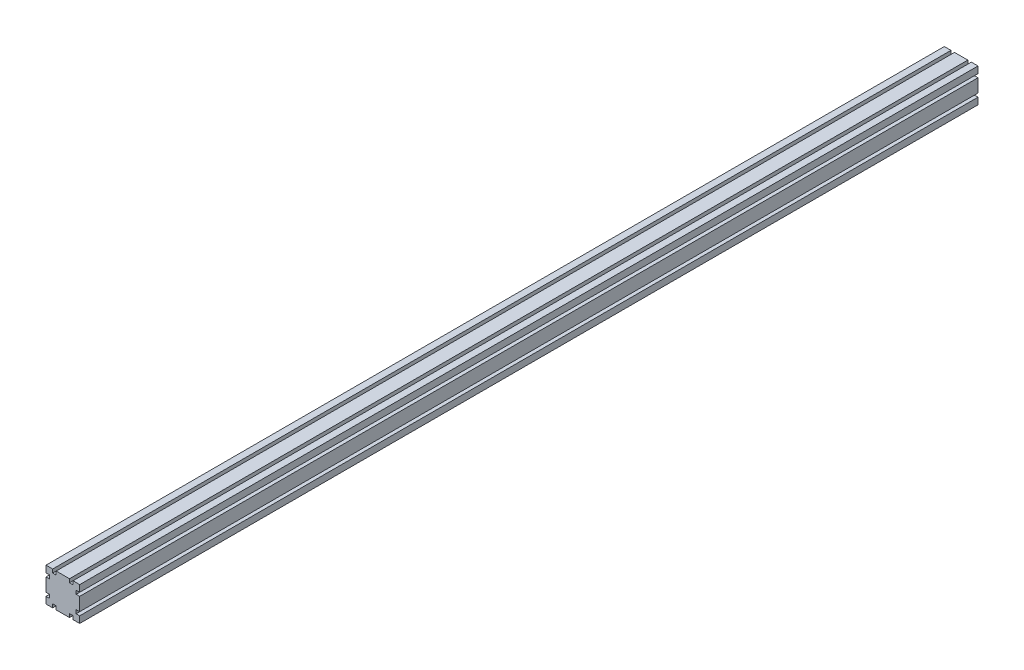
ISO-10303-21;
HEADER;
FILE_DESCRIPTION(('STEP AP214'),'2;1');
FILE_NAME('part.step','',(''),(''),'','','');
FILE_SCHEMA(('AUTOMOTIVE_DESIGN { 1 0 10303 214 1 1 1 1 }'));
ENDSEC;
DATA;
#1=APPLICATION_CONTEXT('core data for automotive mechanical design processes');
#2=APPLICATION_PROTOCOL_DEFINITION('international standard','automotive_design',2000,#1);
#3=PRODUCT_CONTEXT('',#1,'mechanical');
#4=PRODUCT('Part','Part','',(#3));
#5=PRODUCT_RELATED_PRODUCT_CATEGORY('part','',(#4));
#6=PRODUCT_DEFINITION_FORMATION('','',#4);
#7=PRODUCT_DEFINITION_CONTEXT('part definition',#1,'design');
#8=PRODUCT_DEFINITION('design','',#6,#7);
#9=PRODUCT_DEFINITION_SHAPE('','',#8);
#10=(LENGTH_UNIT() NAMED_UNIT(*) SI_UNIT(.MILLI.,.METRE.));
#11=(NAMED_UNIT(*) PLANE_ANGLE_UNIT() SI_UNIT($,.RADIAN.));
#12=(NAMED_UNIT(*) SI_UNIT($,.STERADIAN.) SOLID_ANGLE_UNIT());
#13=UNCERTAINTY_MEASURE_WITH_UNIT(LENGTH_MEASURE(1.E-05),#10,'distance_accuracy_value','');
#14=(GEOMETRIC_REPRESENTATION_CONTEXT(3) GLOBAL_UNCERTAINTY_ASSIGNED_CONTEXT((#13)) GLOBAL_UNIT_ASSIGNED_CONTEXT((#10,
#11,#12)) REPRESENTATION_CONTEXT('',''));
#15=CARTESIAN_POINT('',(0.,0.,0.));
#16=DIRECTION('',(0.,0.,1.));
#17=DIRECTION('',(1.,0.,0.));
#18=AXIS2_PLACEMENT_3D('',#15,#16,#17);
#19=CARTESIAN_POINT('',(-38.1,-23.05,2032.));
#20=DIRECTION('',(1.,0.,0.));
#21=DIRECTION('',(0.,0.,-1.));
#22=AXIS2_PLACEMENT_3D('',#19,#20,#21);
#23=PLANE('',#22);
#24=DIRECTION('',(0.,-1.,0.));
#25=VECTOR('',#24,1.);
#26=CARTESIAN_POINT('',(-38.1,-23.05,0.));
#27=LINE('',#26,#25);
#28=CARTESIAN_POINT('',(-38.1,-23.05,0.));
#29=VERTEX_POINT('',#28);
#30=CARTESIAN_POINT('',(-38.1,-38.1,0.));
#31=VERTEX_POINT('',#30);
#32=EDGE_CURVE('E303',#29,#31,#27,.T.);
#33=ORIENTED_EDGE('',*,*,#32,.T.);
#34=DIRECTION('',(0.,0.,-1.));
#35=VECTOR('',#34,1.);
#36=CARTESIAN_POINT('',(-38.1,-38.1,2032.));
#37=LINE('',#36,#35);
#38=CARTESIAN_POINT('',(-38.1,-38.1,2032.));
#39=VERTEX_POINT('',#38);
#40=EDGE_CURVE('E11',#39,#31,#37,.T.);
#41=ORIENTED_EDGE('',*,*,#40,.F.);
#42=DIRECTION('',(0.,-1.,0.));
#43=VECTOR('',#42,1.);
#44=CARTESIAN_POINT('',(-38.1,-23.05,2032.));
#45=LINE('',#44,#43);
#46=CARTESIAN_POINT('',(-38.1,-23.05,2032.));
#47=VERTEX_POINT('',#46);
#48=EDGE_CURVE('E373',#47,#39,#45,.T.);
#49=ORIENTED_EDGE('',*,*,#48,.F.);
#50=DIRECTION('',(0.,0.,-1.));
#51=VECTOR('',#50,1.);
#52=CARTESIAN_POINT('',(-38.1,-23.05,2032.));
#53=LINE('',#52,#51);
#54=EDGE_CURVE('E299',#47,#29,#53,.T.);
#55=ORIENTED_EDGE('',*,*,#54,.T.);
#56=EDGE_LOOP('',(#33,#41,#49,#55));
#57=FACE_BOUND('',#56,.T.);
#58=ADVANCED_FACE('F39',(#57),#23,.F.);
#59=CARTESIAN_POINT('',(-38.1,-38.1,2032.));
#60=DIRECTION('',(0.,1.,0.));
#61=DIRECTION('',(0.,0.,1.));
#62=AXIS2_PLACEMENT_3D('',#59,#60,#61);
#63=PLANE('',#62);
#64=DIRECTION('',(1.,0.,0.));
#65=VECTOR('',#64,1.);
#66=CARTESIAN_POINT('',(-38.1,-38.1,0.));
#67=LINE('',#66,#65);
#68=CARTESIAN_POINT('',(-23.05,-38.1,0.));
#69=VERTEX_POINT('',#68);
#70=EDGE_CURVE('E306',#31,#69,#67,.T.);
#71=ORIENTED_EDGE('',*,*,#70,.T.);
#72=DIRECTION('',(0.,0.,-1.));
#73=VECTOR('',#72,1.);
#74=CARTESIAN_POINT('',(-23.05,-38.1,2032.));
#75=LINE('',#74,#73);
#76=CARTESIAN_POINT('',(-23.05,-38.1,2032.));
#77=VERTEX_POINT('',#76);
#78=EDGE_CURVE('E47',#77,#69,#75,.T.);
#79=ORIENTED_EDGE('',*,*,#78,.F.);
#80=DIRECTION('',(1.,0.,0.));
#81=VECTOR('',#80,1.);
#82=CARTESIAN_POINT('',(-38.1,-38.1,2032.));
#83=LINE('',#82,#81);
#84=EDGE_CURVE('E182',#39,#77,#83,.T.);
#85=ORIENTED_EDGE('',*,*,#84,.F.);
#86=ORIENTED_EDGE('',*,*,#40,.T.);
#87=EDGE_LOOP('',(#71,#79,#85,#86));
#88=FACE_BOUND('',#87,.T.);
#89=ADVANCED_FACE('F571',(#88),#63,.F.);
#90=CARTESIAN_POINT('',(-23.05,-38.1,2032.));
#91=DIRECTION('',(-1.,0.,0.));
#92=DIRECTION('',(0.,0.,1.));
#93=AXIS2_PLACEMENT_3D('',#90,#91,#92);
#94=PLANE('',#93);
#95=DIRECTION('',(0.,1.,0.));
#96=VECTOR('',#95,1.);
#97=CARTESIAN_POINT('',(-23.05,-38.1,0.));
#98=LINE('',#97,#96);
#99=CARTESIAN_POINT('',(-23.05,-30.1,0.));
#100=VERTEX_POINT('',#99);
#101=EDGE_CURVE('E308',#69,#100,#98,.T.);
#102=ORIENTED_EDGE('',*,*,#101,.T.);
#103=DIRECTION('',(0.,0.,-1.));
#104=VECTOR('',#103,1.);
#105=CARTESIAN_POINT('',(-23.05,-30.1,2032.));
#106=LINE('',#105,#104);
#107=CARTESIAN_POINT('',(-23.05,-30.1,2032.));
#108=VERTEX_POINT('',#107);
#109=EDGE_CURVE('E464',#108,#100,#106,.T.);
#110=ORIENTED_EDGE('',*,*,#109,.F.);
#111=DIRECTION('',(0.,1.,0.));
#112=VECTOR('',#111,1.);
#113=CARTESIAN_POINT('',(-23.05,-38.1,2032.));
#114=LINE('',#113,#112);
#115=EDGE_CURVE('E472',#77,#108,#114,.T.);
#116=ORIENTED_EDGE('',*,*,#115,.F.);
#117=ORIENTED_EDGE('',*,*,#78,.T.);
#118=EDGE_LOOP('',(#102,#110,#116,#117));
#119=FACE_BOUND('',#118,.T.);
#120=ADVANCED_FACE('F470',(#119),#94,.F.);
#121=CARTESIAN_POINT('',(-23.05,-30.1,2032.));
#122=DIRECTION('',(0.,1.,0.));
#123=DIRECTION('',(0.,0.,1.));
#124=AXIS2_PLACEMENT_3D('',#121,#122,#123);
#125=PLANE('',#124);
#126=DIRECTION('',(1.,0.,0.));
#127=VECTOR('',#126,1.);
#128=CARTESIAN_POINT('',(-23.05,-30.1,0.));
#129=LINE('',#128,#127);
#130=CARTESIAN_POINT('',(-15.05,-30.1,0.));
#131=VERTEX_POINT('',#130);
#132=EDGE_CURVE('E310',#100,#131,#129,.T.);
#133=ORIENTED_EDGE('',*,*,#132,.T.);
#134=DIRECTION('',(0.,0.,-1.));
#135=VECTOR('',#134,1.);
#136=CARTESIAN_POINT('',(-15.05,-30.1,2032.));
#137=LINE('',#136,#135);
#138=CARTESIAN_POINT('',(-15.05,-30.1,2032.));
#139=VERTEX_POINT('',#138);
#140=EDGE_CURVE('E461',#139,#131,#137,.T.);
#141=ORIENTED_EDGE('',*,*,#140,.F.);
#142=DIRECTION('',(1.,0.,0.));
#143=VECTOR('',#142,1.);
#144=CARTESIAN_POINT('',(-23.05,-30.1,2032.));
#145=LINE('',#144,#143);
#146=EDGE_CURVE('E490',#108,#139,#145,.T.);
#147=ORIENTED_EDGE('',*,*,#146,.F.);
#148=ORIENTED_EDGE('',*,*,#109,.T.);
#149=EDGE_LOOP('',(#133,#141,#147,#148));
#150=FACE_BOUND('',#149,.T.);
#151=ADVANCED_FACE('F481',(#150),#125,.F.);
#152=CARTESIAN_POINT('',(-15.05,-30.1,2032.));
#153=DIRECTION('',(1.,0.,0.));
#154=DIRECTION('',(0.,0.,-1.));
#155=AXIS2_PLACEMENT_3D('',#152,#153,#154);
#156=PLANE('',#155);
#157=DIRECTION('',(0.,-1.,0.));
#158=VECTOR('',#157,1.);
#159=CARTESIAN_POINT('',(-15.05,-30.1,0.));
#160=LINE('',#159,#158);
#161=CARTESIAN_POINT('',(-15.05,-38.1,0.));
#162=VERTEX_POINT('',#161);
#163=EDGE_CURVE('E312',#131,#162,#160,.T.);
#164=ORIENTED_EDGE('',*,*,#163,.T.);
#165=DIRECTION('',(0.,0.,-1.));
#166=VECTOR('',#165,1.);
#167=CARTESIAN_POINT('',(-15.05,-38.1,2032.));
#168=LINE('',#167,#166);
#169=CARTESIAN_POINT('',(-15.05,-38.1,2032.));
#170=VERTEX_POINT('',#169);
#171=EDGE_CURVE('E458',#170,#162,#168,.T.);
#172=ORIENTED_EDGE('',*,*,#171,.F.);
#173=DIRECTION('',(0.,-1.,0.));
#174=VECTOR('',#173,1.);
#175=CARTESIAN_POINT('',(-15.05,-30.1,2032.));
#176=LINE('',#175,#174);
#177=EDGE_CURVE('E487',#139,#170,#176,.T.);
#178=ORIENTED_EDGE('',*,*,#177,.F.);
#179=ORIENTED_EDGE('',*,*,#140,.T.);
#180=EDGE_LOOP('',(#164,#172,#178,#179));
#181=FACE_BOUND('',#180,.T.);
#182=ADVANCED_FACE('F485',(#181),#156,.F.);
#183=CARTESIAN_POINT('',(-15.05,-38.1,2032.));
#184=DIRECTION('',(0.,1.,0.));
#185=DIRECTION('',(0.,0.,1.));
#186=AXIS2_PLACEMENT_3D('',#183,#184,#185);
#187=PLANE('',#186);
#188=DIRECTION('',(1.,0.,0.));
#189=VECTOR('',#188,1.);
#190=CARTESIAN_POINT('',(-15.05,-38.1,0.));
#191=LINE('',#190,#189);
#192=CARTESIAN_POINT('',(15.05,-38.1,0.));
#193=VERTEX_POINT('',#192);
#194=EDGE_CURVE('E314',#162,#193,#191,.T.);
#195=ORIENTED_EDGE('',*,*,#194,.T.);
#196=DIRECTION('',(0.,0.,-1.));
#197=VECTOR('',#196,1.);
#198=CARTESIAN_POINT('',(15.05,-38.1,2032.));
#199=LINE('',#198,#197);
#200=CARTESIAN_POINT('',(15.05,-38.1,2032.));
#201=VERTEX_POINT('',#200);
#202=EDGE_CURVE('E455',#201,#193,#199,.T.);
#203=ORIENTED_EDGE('',*,*,#202,.F.);
#204=DIRECTION('',(1.,0.,0.));
#205=VECTOR('',#204,1.);
#206=CARTESIAN_POINT('',(-15.05,-38.1,2032.));
#207=LINE('',#206,#205);
#208=EDGE_CURVE('E489',#170,#201,#207,.T.);
#209=ORIENTED_EDGE('',*,*,#208,.F.);
#210=ORIENTED_EDGE('',*,*,#171,.T.);
#211=EDGE_LOOP('',(#195,#203,#209,#210));
#212=FACE_BOUND('',#211,.T.);
#213=ADVANCED_FACE('F584',(#212),#187,.F.);
#214=CARTESIAN_POINT('',(15.05,-38.1,2032.));
#215=DIRECTION('',(-1.,0.,0.));
#216=DIRECTION('',(0.,0.,1.));
#217=AXIS2_PLACEMENT_3D('',#214,#215,#216);
#218=PLANE('',#217);
#219=DIRECTION('',(0.,1.,0.));
#220=VECTOR('',#219,1.);
#221=CARTESIAN_POINT('',(15.05,-38.1,0.));
#222=LINE('',#221,#220);
#223=CARTESIAN_POINT('',(15.05,-30.1,0.));
#224=VERTEX_POINT('',#223);
#225=EDGE_CURVE('E316',#193,#224,#222,.T.);
#226=ORIENTED_EDGE('',*,*,#225,.T.);
#227=DIRECTION('',(0.,0.,-1.));
#228=VECTOR('',#227,1.);
#229=CARTESIAN_POINT('',(15.05,-30.1,2032.));
#230=LINE('',#229,#228);
#231=CARTESIAN_POINT('',(15.05,-30.1,2032.));
#232=VERTEX_POINT('',#231);
#233=EDGE_CURVE('E452',#232,#224,#230,.T.);
#234=ORIENTED_EDGE('',*,*,#233,.F.);
#235=DIRECTION('',(0.,1.,0.));
#236=VECTOR('',#235,1.);
#237=CARTESIAN_POINT('',(15.05,-38.1,2032.));
#238=LINE('',#237,#236);
#239=EDGE_CURVE('E492',#201,#232,#238,.T.);
#240=ORIENTED_EDGE('',*,*,#239,.F.);
#241=ORIENTED_EDGE('',*,*,#202,.T.);
#242=EDGE_LOOP('',(#226,#234,#240,#241));
#243=FACE_BOUND('',#242,.T.);
#244=ADVANCED_FACE('F587',(#243),#218,.F.);
#245=CARTESIAN_POINT('',(15.05,-30.1,2032.));
#246=DIRECTION('',(0.,1.,0.));
#247=DIRECTION('',(0.,0.,1.));
#248=AXIS2_PLACEMENT_3D('',#245,#246,#247);
#249=PLANE('',#248);
#250=DIRECTION('',(1.,0.,0.));
#251=VECTOR('',#250,1.);
#252=CARTESIAN_POINT('',(15.05,-30.1,0.));
#253=LINE('',#252,#251);
#254=CARTESIAN_POINT('',(23.05,-30.1,0.));
#255=VERTEX_POINT('',#254);
#256=EDGE_CURVE('E318',#224,#255,#253,.T.);
#257=ORIENTED_EDGE('',*,*,#256,.T.);
#258=DIRECTION('',(0.,0.,-1.));
#259=VECTOR('',#258,1.);
#260=CARTESIAN_POINT('',(23.05,-30.1,2032.));
#261=LINE('',#260,#259);
#262=CARTESIAN_POINT('',(23.05,-30.1,2032.));
#263=VERTEX_POINT('',#262);
#264=EDGE_CURVE('E449',#263,#255,#261,.T.);
#265=ORIENTED_EDGE('',*,*,#264,.F.);
#266=DIRECTION('',(1.,0.,0.));
#267=VECTOR('',#266,1.);
#268=CARTESIAN_POINT('',(15.05,-30.1,2032.));
#269=LINE('',#268,#267);
#270=EDGE_CURVE('E498',#232,#263,#269,.T.);
#271=ORIENTED_EDGE('',*,*,#270,.F.);
#272=ORIENTED_EDGE('',*,*,#233,.T.);
#273=EDGE_LOOP('',(#257,#265,#271,#272));
#274=FACE_BOUND('',#273,.T.);
#275=ADVANCED_FACE('F591',(#274),#249,.F.);
#276=CARTESIAN_POINT('',(23.05,-30.1,2032.));
#277=DIRECTION('',(1.,0.,0.));
#278=DIRECTION('',(0.,0.,-1.));
#279=AXIS2_PLACEMENT_3D('',#276,#277,#278);
#280=PLANE('',#279);
#281=DIRECTION('',(0.,-1.,0.));
#282=VECTOR('',#281,1.);
#283=CARTESIAN_POINT('',(23.05,-30.1,0.));
#284=LINE('',#283,#282);
#285=CARTESIAN_POINT('',(23.05,-38.1,0.));
#286=VERTEX_POINT('',#285);
#287=EDGE_CURVE('E320',#255,#286,#284,.T.);
#288=ORIENTED_EDGE('',*,*,#287,.T.);
#289=DIRECTION('',(0.,0.,-1.));
#290=VECTOR('',#289,1.);
#291=CARTESIAN_POINT('',(23.05,-38.1,2032.));
#292=LINE('',#291,#290);
#293=CARTESIAN_POINT('',(23.05,-38.1,2032.));
#294=VERTEX_POINT('',#293);
#295=EDGE_CURVE('E446',#294,#286,#292,.T.);
#296=ORIENTED_EDGE('',*,*,#295,.F.);
#297=DIRECTION('',(0.,-1.,0.));
#298=VECTOR('',#297,1.);
#299=CARTESIAN_POINT('',(23.05,-30.1,2032.));
#300=LINE('',#299,#298);
#301=EDGE_CURVE('E500',#263,#294,#300,.T.);
#302=ORIENTED_EDGE('',*,*,#301,.F.);
#303=ORIENTED_EDGE('',*,*,#264,.T.);
#304=EDGE_LOOP('',(#288,#296,#302,#303));
#305=FACE_BOUND('',#304,.T.);
#306=ADVANCED_FACE('F595',(#305),#280,.F.);
#307=CARTESIAN_POINT('',(23.05,-38.1,2032.));
#308=DIRECTION('',(0.,1.,0.));
#309=DIRECTION('',(0.,0.,1.));
#310=AXIS2_PLACEMENT_3D('',#307,#308,#309);
#311=PLANE('',#310);
#312=DIRECTION('',(1.,0.,0.));
#313=VECTOR('',#312,1.);
#314=CARTESIAN_POINT('',(23.05,-38.1,0.));
#315=LINE('',#314,#313);
#316=CARTESIAN_POINT('',(38.1,-38.1,0.));
#317=VERTEX_POINT('',#316);
#318=EDGE_CURVE('E322',#286,#317,#315,.T.);
#319=ORIENTED_EDGE('',*,*,#318,.T.);
#320=DIRECTION('',(0.,0.,-1.));
#321=VECTOR('',#320,1.);
#322=CARTESIAN_POINT('',(38.1,-38.1,2032.));
#323=LINE('',#322,#321);
#324=CARTESIAN_POINT('',(38.1,-38.1,2032.));
#325=VERTEX_POINT('',#324);
#326=EDGE_CURVE('E443',#325,#317,#323,.T.);
#327=ORIENTED_EDGE('',*,*,#326,.F.);
#328=DIRECTION('',(1.,0.,0.));
#329=VECTOR('',#328,1.);
#330=CARTESIAN_POINT('',(23.05,-38.1,2032.));
#331=LINE('',#330,#329);
#332=EDGE_CURVE('E502',#294,#325,#331,.T.);
#333=ORIENTED_EDGE('',*,*,#332,.F.);
#334=ORIENTED_EDGE('',*,*,#295,.T.);
#335=EDGE_LOOP('',(#319,#327,#333,#334));
#336=FACE_BOUND('',#335,.T.);
#337=ADVANCED_FACE('F599',(#336),#311,.F.);
#338=CARTESIAN_POINT('',(38.1,-38.1,2032.));
#339=DIRECTION('',(-1.,0.,0.));
#340=DIRECTION('',(0.,0.,1.));
#341=AXIS2_PLACEMENT_3D('',#338,#339,#340);
#342=PLANE('',#341);
#343=DIRECTION('',(0.,1.,0.));
#344=VECTOR('',#343,1.);
#345=CARTESIAN_POINT('',(38.1,-38.1,0.));
#346=LINE('',#345,#344);
#347=CARTESIAN_POINT('',(38.1,-23.05,0.));
#348=VERTEX_POINT('',#347);
#349=EDGE_CURVE('E324',#317,#348,#346,.T.);
#350=ORIENTED_EDGE('',*,*,#349,.T.);
#351=DIRECTION('',(0.,0.,-1.));
#352=VECTOR('',#351,1.);
#353=CARTESIAN_POINT('',(38.1,-23.05,2032.));
#354=LINE('',#353,#352);
#355=CARTESIAN_POINT('',(38.1,-23.05,2032.));
#356=VERTEX_POINT('',#355);
#357=EDGE_CURVE('E440',#356,#348,#354,.T.);
#358=ORIENTED_EDGE('',*,*,#357,.F.);
#359=DIRECTION('',(0.,1.,0.));
#360=VECTOR('',#359,1.);
#361=CARTESIAN_POINT('',(38.1,-38.1,2032.));
#362=LINE('',#361,#360);
#363=EDGE_CURVE('E504',#325,#356,#362,.T.);
#364=ORIENTED_EDGE('',*,*,#363,.F.);
#365=ORIENTED_EDGE('',*,*,#326,.T.);
#366=EDGE_LOOP('',(#350,#358,#364,#365));
#367=FACE_BOUND('',#366,.T.);
#368=ADVANCED_FACE('F603',(#367),#342,.F.);
#369=CARTESIAN_POINT('',(38.1,-23.05,2032.));
#370=DIRECTION('',(0.,-1.,0.));
#371=DIRECTION('',(0.,0.,-1.));
#372=AXIS2_PLACEMENT_3D('',#369,#370,#371);
#373=PLANE('',#372);
#374=DIRECTION('',(-1.,0.,0.));
#375=VECTOR('',#374,1.);
#376=CARTESIAN_POINT('',(38.1,-23.05,0.));
#377=LINE('',#376,#375);
#378=CARTESIAN_POINT('',(30.1,-23.05,0.));
#379=VERTEX_POINT('',#378);
#380=EDGE_CURVE('E326',#348,#379,#377,.T.);
#381=ORIENTED_EDGE('',*,*,#380,.T.);
#382=DIRECTION('',(0.,0.,-1.));
#383=VECTOR('',#382,1.);
#384=CARTESIAN_POINT('',(30.1,-23.05,2032.));
#385=LINE('',#384,#383);
#386=CARTESIAN_POINT('',(30.1,-23.05,2032.));
#387=VERTEX_POINT('',#386);
#388=EDGE_CURVE('E437',#387,#379,#385,.T.);
#389=ORIENTED_EDGE('',*,*,#388,.F.);
#390=DIRECTION('',(-1.,0.,0.));
#391=VECTOR('',#390,1.);
#392=CARTESIAN_POINT('',(38.1,-23.05,2032.));
#393=LINE('',#392,#391);
#394=EDGE_CURVE('E506',#356,#387,#393,.T.);
#395=ORIENTED_EDGE('',*,*,#394,.F.);
#396=ORIENTED_EDGE('',*,*,#357,.T.);
#397=EDGE_LOOP('',(#381,#389,#395,#396));
#398=FACE_BOUND('',#397,.T.);
#399=ADVANCED_FACE('F607',(#398),#373,.F.);
#400=CARTESIAN_POINT('',(30.1,-23.05,2032.));
#401=DIRECTION('',(-1.,0.,0.));
#402=DIRECTION('',(0.,0.,1.));
#403=AXIS2_PLACEMENT_3D('',#400,#401,#402);
#404=PLANE('',#403);
#405=DIRECTION('',(0.,1.,0.));
#406=VECTOR('',#405,1.);
#407=CARTESIAN_POINT('',(30.1,-23.05,0.));
#408=LINE('',#407,#406);
#409=CARTESIAN_POINT('',(30.1,-15.05,0.));
#410=VERTEX_POINT('',#409);
#411=EDGE_CURVE('E328',#379,#410,#408,.T.);
#412=ORIENTED_EDGE('',*,*,#411,.T.);
#413=DIRECTION('',(0.,0.,-1.));
#414=VECTOR('',#413,1.);
#415=CARTESIAN_POINT('',(30.1,-15.05,2032.));
#416=LINE('',#415,#414);
#417=CARTESIAN_POINT('',(30.1,-15.05,2032.));
#418=VERTEX_POINT('',#417);
#419=EDGE_CURVE('E434',#418,#410,#416,.T.);
#420=ORIENTED_EDGE('',*,*,#419,.F.);
#421=DIRECTION('',(0.,1.,0.));
#422=VECTOR('',#421,1.);
#423=CARTESIAN_POINT('',(30.1,-23.05,2032.));
#424=LINE('',#423,#422);
#425=EDGE_CURVE('E508',#387,#418,#424,.T.);
#426=ORIENTED_EDGE('',*,*,#425,.F.);
#427=ORIENTED_EDGE('',*,*,#388,.T.);
#428=EDGE_LOOP('',(#412,#420,#426,#427));
#429=FACE_BOUND('',#428,.T.);
#430=ADVANCED_FACE('F611',(#429),#404,.F.);
#431=CARTESIAN_POINT('',(30.1,-15.05,2032.));
#432=DIRECTION('',(0.,1.,0.));
#433=DIRECTION('',(0.,0.,1.));
#434=AXIS2_PLACEMENT_3D('',#431,#432,#433);
#435=PLANE('',#434);
#436=DIRECTION('',(1.,0.,0.));
#437=VECTOR('',#436,1.);
#438=CARTESIAN_POINT('',(30.1,-15.05,0.));
#439=LINE('',#438,#437);
#440=CARTESIAN_POINT('',(38.1,-15.05,0.));
#441=VERTEX_POINT('',#440);
#442=EDGE_CURVE('E330',#410,#441,#439,.T.);
#443=ORIENTED_EDGE('',*,*,#442,.T.);
#444=DIRECTION('',(0.,0.,-1.));
#445=VECTOR('',#444,1.);
#446=CARTESIAN_POINT('',(38.1,-15.05,2032.));
#447=LINE('',#446,#445);
#448=CARTESIAN_POINT('',(38.1,-15.05,2032.));
#449=VERTEX_POINT('',#448);
#450=EDGE_CURVE('E431',#449,#441,#447,.T.);
#451=ORIENTED_EDGE('',*,*,#450,.F.);
#452=DIRECTION('',(1.,0.,0.));
#453=VECTOR('',#452,1.);
#454=CARTESIAN_POINT('',(30.1,-15.05,2032.));
#455=LINE('',#454,#453);
#456=EDGE_CURVE('E510',#418,#449,#455,.T.);
#457=ORIENTED_EDGE('',*,*,#456,.F.);
#458=ORIENTED_EDGE('',*,*,#419,.T.);
#459=EDGE_LOOP('',(#443,#451,#457,#458));
#460=FACE_BOUND('',#459,.T.);
#461=ADVANCED_FACE('F615',(#460),#435,.F.);
#462=CARTESIAN_POINT('',(38.1,-15.05,2032.));
#463=DIRECTION('',(-1.,0.,0.));
#464=DIRECTION('',(0.,0.,1.));
#465=AXIS2_PLACEMENT_3D('',#462,#463,#464);
#466=PLANE('',#465);
#467=DIRECTION('',(0.,1.,0.));
#468=VECTOR('',#467,1.);
#469=CARTESIAN_POINT('',(38.1,-15.05,0.));
#470=LINE('',#469,#468);
#471=CARTESIAN_POINT('',(38.1,15.05,0.));
#472=VERTEX_POINT('',#471);
#473=EDGE_CURVE('E332',#441,#472,#470,.T.);
#474=ORIENTED_EDGE('',*,*,#473,.T.);
#475=DIRECTION('',(0.,0.,-1.));
#476=VECTOR('',#475,1.);
#477=CARTESIAN_POINT('',(38.1,15.05,2032.));
#478=LINE('',#477,#476);
#479=CARTESIAN_POINT('',(38.1,15.05,2032.));
#480=VERTEX_POINT('',#479);
#481=EDGE_CURVE('E428',#480,#472,#478,.T.);
#482=ORIENTED_EDGE('',*,*,#481,.F.);
#483=DIRECTION('',(0.,1.,0.));
#484=VECTOR('',#483,1.);
#485=CARTESIAN_POINT('',(38.1,-15.05,2032.));
#486=LINE('',#485,#484);
#487=EDGE_CURVE('E512',#449,#480,#486,.T.);
#488=ORIENTED_EDGE('',*,*,#487,.F.);
#489=ORIENTED_EDGE('',*,*,#450,.T.);
#490=EDGE_LOOP('',(#474,#482,#488,#489));
#491=FACE_BOUND('',#490,.T.);
#492=ADVANCED_FACE('F619',(#491),#466,.F.);
#493=CARTESIAN_POINT('',(38.1,15.05,2032.));
#494=DIRECTION('',(0.,-1.,0.));
#495=DIRECTION('',(0.,0.,-1.));
#496=AXIS2_PLACEMENT_3D('',#493,#494,#495);
#497=PLANE('',#496);
#498=DIRECTION('',(-1.,0.,0.));
#499=VECTOR('',#498,1.);
#500=CARTESIAN_POINT('',(38.1,15.05,0.));
#501=LINE('',#500,#499);
#502=CARTESIAN_POINT('',(30.1,15.05,0.));
#503=VERTEX_POINT('',#502);
#504=EDGE_CURVE('E334',#472,#503,#501,.T.);
#505=ORIENTED_EDGE('',*,*,#504,.T.);
#506=DIRECTION('',(0.,0.,-1.));
#507=VECTOR('',#506,1.);
#508=CARTESIAN_POINT('',(30.1,15.05,2032.));
#509=LINE('',#508,#507);
#510=CARTESIAN_POINT('',(30.1,15.05,2032.));
#511=VERTEX_POINT('',#510);
#512=EDGE_CURVE('E425',#511,#503,#509,.T.);
#513=ORIENTED_EDGE('',*,*,#512,.F.);
#514=DIRECTION('',(-1.,0.,0.));
#515=VECTOR('',#514,1.);
#516=CARTESIAN_POINT('',(38.1,15.05,2032.));
#517=LINE('',#516,#515);
#518=EDGE_CURVE('E514',#480,#511,#517,.T.);
#519=ORIENTED_EDGE('',*,*,#518,.F.);
#520=ORIENTED_EDGE('',*,*,#481,.T.);
#521=EDGE_LOOP('',(#505,#513,#519,#520));
#522=FACE_BOUND('',#521,.T.);
#523=ADVANCED_FACE('F623',(#522),#497,.F.);
#524=CARTESIAN_POINT('',(30.1,15.05,2032.));
#525=DIRECTION('',(-1.,0.,0.));
#526=DIRECTION('',(0.,0.,1.));
#527=AXIS2_PLACEMENT_3D('',#524,#525,#526);
#528=PLANE('',#527);
#529=DIRECTION('',(0.,1.,0.));
#530=VECTOR('',#529,1.);
#531=CARTESIAN_POINT('',(30.1,15.05,0.));
#532=LINE('',#531,#530);
#533=CARTESIAN_POINT('',(30.1,23.05,0.));
#534=VERTEX_POINT('',#533);
#535=EDGE_CURVE('E336',#503,#534,#532,.T.);
#536=ORIENTED_EDGE('',*,*,#535,.T.);
#537=DIRECTION('',(0.,0.,-1.));
#538=VECTOR('',#537,1.);
#539=CARTESIAN_POINT('',(30.1,23.05,2032.));
#540=LINE('',#539,#538);
#541=CARTESIAN_POINT('',(30.1,23.05,2032.));
#542=VERTEX_POINT('',#541);
#543=EDGE_CURVE('E422',#542,#534,#540,.T.);
#544=ORIENTED_EDGE('',*,*,#543,.F.);
#545=DIRECTION('',(0.,1.,0.));
#546=VECTOR('',#545,1.);
#547=CARTESIAN_POINT('',(30.1,15.05,2032.));
#548=LINE('',#547,#546);
#549=EDGE_CURVE('E516',#511,#542,#548,.T.);
#550=ORIENTED_EDGE('',*,*,#549,.F.);
#551=ORIENTED_EDGE('',*,*,#512,.T.);
#552=EDGE_LOOP('',(#536,#544,#550,#551));
#553=FACE_BOUND('',#552,.T.);
#554=ADVANCED_FACE('F627',(#553),#528,.F.);
#555=CARTESIAN_POINT('',(30.1,23.05,2032.));
#556=DIRECTION('',(0.,1.,0.));
#557=DIRECTION('',(0.,0.,1.));
#558=AXIS2_PLACEMENT_3D('',#555,#556,#557);
#559=PLANE('',#558);
#560=DIRECTION('',(1.,0.,0.));
#561=VECTOR('',#560,1.);
#562=CARTESIAN_POINT('',(30.1,23.05,0.));
#563=LINE('',#562,#561);
#564=CARTESIAN_POINT('',(38.1,23.05,0.));
#565=VERTEX_POINT('',#564);
#566=EDGE_CURVE('E338',#534,#565,#563,.T.);
#567=ORIENTED_EDGE('',*,*,#566,.T.);
#568=DIRECTION('',(0.,0.,-1.));
#569=VECTOR('',#568,1.);
#570=CARTESIAN_POINT('',(38.1,23.05,2032.));
#571=LINE('',#570,#569);
#572=CARTESIAN_POINT('',(38.1,23.05,2032.));
#573=VERTEX_POINT('',#572);
#574=EDGE_CURVE('E419',#573,#565,#571,.T.);
#575=ORIENTED_EDGE('',*,*,#574,.F.);
#576=DIRECTION('',(1.,0.,0.));
#577=VECTOR('',#576,1.);
#578=CARTESIAN_POINT('',(30.1,23.05,2032.));
#579=LINE('',#578,#577);
#580=EDGE_CURVE('E518',#542,#573,#579,.T.);
#581=ORIENTED_EDGE('',*,*,#580,.F.);
#582=ORIENTED_EDGE('',*,*,#543,.T.);
#583=EDGE_LOOP('',(#567,#575,#581,#582));
#584=FACE_BOUND('',#583,.T.);
#585=ADVANCED_FACE('F631',(#584),#559,.F.);
#586=CARTESIAN_POINT('',(38.1,23.05,2032.));
#587=DIRECTION('',(-1.,0.,0.));
#588=DIRECTION('',(0.,0.,1.));
#589=AXIS2_PLACEMENT_3D('',#586,#587,#588);
#590=PLANE('',#589);
#591=DIRECTION('',(0.,1.,0.));
#592=VECTOR('',#591,1.);
#593=CARTESIAN_POINT('',(38.1,23.05,0.));
#594=LINE('',#593,#592);
#595=CARTESIAN_POINT('',(38.1,38.1,0.));
#596=VERTEX_POINT('',#595);
#597=EDGE_CURVE('E340',#565,#596,#594,.T.);
#598=ORIENTED_EDGE('',*,*,#597,.T.);
#599=DIRECTION('',(0.,0.,-1.));
#600=VECTOR('',#599,1.);
#601=CARTESIAN_POINT('',(38.1,38.1,2032.));
#602=LINE('',#601,#600);
#603=CARTESIAN_POINT('',(38.1,38.1,2032.));
#604=VERTEX_POINT('',#603);
#605=EDGE_CURVE('E416',#604,#596,#602,.T.);
#606=ORIENTED_EDGE('',*,*,#605,.F.);
#607=DIRECTION('',(0.,1.,0.));
#608=VECTOR('',#607,1.);
#609=CARTESIAN_POINT('',(38.1,23.05,2032.));
#610=LINE('',#609,#608);
#611=EDGE_CURVE('E520',#573,#604,#610,.T.);
#612=ORIENTED_EDGE('',*,*,#611,.F.);
#613=ORIENTED_EDGE('',*,*,#574,.T.);
#614=EDGE_LOOP('',(#598,#606,#612,#613));
#615=FACE_BOUND('',#614,.T.);
#616=ADVANCED_FACE('F635',(#615),#590,.F.);
#617=CARTESIAN_POINT('',(38.1,38.1,2032.));
#618=DIRECTION('',(0.,-1.,0.));
#619=DIRECTION('',(0.,0.,-1.));
#620=AXIS2_PLACEMENT_3D('',#617,#618,#619);
#621=PLANE('',#620);
#622=DIRECTION('',(-1.,0.,0.));
#623=VECTOR('',#622,1.);
#624=CARTESIAN_POINT('',(38.1,38.1,0.));
#625=LINE('',#624,#623);
#626=CARTESIAN_POINT('',(23.05,38.1,0.));
#627=VERTEX_POINT('',#626);
#628=EDGE_CURVE('E342',#596,#627,#625,.T.);
#629=ORIENTED_EDGE('',*,*,#628,.T.);
#630=DIRECTION('',(0.,0.,-1.));
#631=VECTOR('',#630,1.);
#632=CARTESIAN_POINT('',(23.05,38.1,2032.));
#633=LINE('',#632,#631);
#634=CARTESIAN_POINT('',(23.05,38.1,2032.));
#635=VERTEX_POINT('',#634);
#636=EDGE_CURVE('E413',#635,#627,#633,.T.);
#637=ORIENTED_EDGE('',*,*,#636,.F.);
#638=DIRECTION('',(-1.,0.,0.));
#639=VECTOR('',#638,1.);
#640=CARTESIAN_POINT('',(38.1,38.1,2032.));
#641=LINE('',#640,#639);
#642=EDGE_CURVE('E522',#604,#635,#641,.T.);
#643=ORIENTED_EDGE('',*,*,#642,.F.);
#644=ORIENTED_EDGE('',*,*,#605,.T.);
#645=EDGE_LOOP('',(#629,#637,#643,#644));
#646=FACE_BOUND('',#645,.T.);
#647=ADVANCED_FACE('F639',(#646),#621,.F.);
#648=CARTESIAN_POINT('',(23.05,38.1,2032.));
#649=DIRECTION('',(1.,0.,0.));
#650=DIRECTION('',(0.,0.,-1.));
#651=AXIS2_PLACEMENT_3D('',#648,#649,#650);
#652=PLANE('',#651);
#653=DIRECTION('',(0.,-1.,0.));
#654=VECTOR('',#653,1.);
#655=CARTESIAN_POINT('',(23.05,38.1,0.));
#656=LINE('',#655,#654);
#657=CARTESIAN_POINT('',(23.05,30.1,0.));
#658=VERTEX_POINT('',#657);
#659=EDGE_CURVE('E344',#627,#658,#656,.T.);
#660=ORIENTED_EDGE('',*,*,#659,.T.);
#661=DIRECTION('',(0.,0.,-1.));
#662=VECTOR('',#661,1.);
#663=CARTESIAN_POINT('',(23.05,30.1,2032.));
#664=LINE('',#663,#662);
#665=CARTESIAN_POINT('',(23.05,30.1,2032.));
#666=VERTEX_POINT('',#665);
#667=EDGE_CURVE('E410',#666,#658,#664,.T.);
#668=ORIENTED_EDGE('',*,*,#667,.F.);
#669=DIRECTION('',(0.,-1.,0.));
#670=VECTOR('',#669,1.);
#671=CARTESIAN_POINT('',(23.05,38.1,2032.));
#672=LINE('',#671,#670);
#673=EDGE_CURVE('E524',#635,#666,#672,.T.);
#674=ORIENTED_EDGE('',*,*,#673,.F.);
#675=ORIENTED_EDGE('',*,*,#636,.T.);
#676=EDGE_LOOP('',(#660,#668,#674,#675));
#677=FACE_BOUND('',#676,.T.);
#678=ADVANCED_FACE('F643',(#677),#652,.F.);
#679=CARTESIAN_POINT('',(23.05,30.1,2032.));
#680=DIRECTION('',(0.,-1.,0.));
#681=DIRECTION('',(0.,0.,-1.));
#682=AXIS2_PLACEMENT_3D('',#679,#680,#681);
#683=PLANE('',#682);
#684=DIRECTION('',(-1.,0.,0.));
#685=VECTOR('',#684,1.);
#686=CARTESIAN_POINT('',(23.05,30.1,0.));
#687=LINE('',#686,#685);
#688=CARTESIAN_POINT('',(15.05,30.1,0.));
#689=VERTEX_POINT('',#688);
#690=EDGE_CURVE('E346',#658,#689,#687,.T.);
#691=ORIENTED_EDGE('',*,*,#690,.T.);
#692=DIRECTION('',(0.,0.,-1.));
#693=VECTOR('',#692,1.);
#694=CARTESIAN_POINT('',(15.05,30.1,2032.));
#695=LINE('',#694,#693);
#696=CARTESIAN_POINT('',(15.05,30.1,2032.));
#697=VERTEX_POINT('',#696);
#698=EDGE_CURVE('E407',#697,#689,#695,.T.);
#699=ORIENTED_EDGE('',*,*,#698,.F.);
#700=DIRECTION('',(-1.,0.,0.));
#701=VECTOR('',#700,1.);
#702=CARTESIAN_POINT('',(23.05,30.1,2032.));
#703=LINE('',#702,#701);
#704=EDGE_CURVE('E526',#666,#697,#703,.T.);
#705=ORIENTED_EDGE('',*,*,#704,.F.);
#706=ORIENTED_EDGE('',*,*,#667,.T.);
#707=EDGE_LOOP('',(#691,#699,#705,#706));
#708=FACE_BOUND('',#707,.T.);
#709=ADVANCED_FACE('F647',(#708),#683,.F.);
#710=CARTESIAN_POINT('',(15.05,30.1,2032.));
#711=DIRECTION('',(-1.,0.,0.));
#712=DIRECTION('',(0.,0.,1.));
#713=AXIS2_PLACEMENT_3D('',#710,#711,#712);
#714=PLANE('',#713);
#715=DIRECTION('',(0.,1.,0.));
#716=VECTOR('',#715,1.);
#717=CARTESIAN_POINT('',(15.05,30.1,0.));
#718=LINE('',#717,#716);
#719=CARTESIAN_POINT('',(15.05,38.1,0.));
#720=VERTEX_POINT('',#719);
#721=EDGE_CURVE('E348',#689,#720,#718,.T.);
#722=ORIENTED_EDGE('',*,*,#721,.T.);
#723=DIRECTION('',(0.,0.,-1.));
#724=VECTOR('',#723,1.);
#725=CARTESIAN_POINT('',(15.05,38.1,2032.));
#726=LINE('',#725,#724);
#727=CARTESIAN_POINT('',(15.05,38.1,2032.));
#728=VERTEX_POINT('',#727);
#729=EDGE_CURVE('E404',#728,#720,#726,.T.);
#730=ORIENTED_EDGE('',*,*,#729,.F.);
#731=DIRECTION('',(0.,1.,0.));
#732=VECTOR('',#731,1.);
#733=CARTESIAN_POINT('',(15.05,30.1,2032.));
#734=LINE('',#733,#732);
#735=EDGE_CURVE('E528',#697,#728,#734,.T.);
#736=ORIENTED_EDGE('',*,*,#735,.F.);
#737=ORIENTED_EDGE('',*,*,#698,.T.);
#738=EDGE_LOOP('',(#722,#730,#736,#737));
#739=FACE_BOUND('',#738,.T.);
#740=ADVANCED_FACE('F651',(#739),#714,.F.);
#741=CARTESIAN_POINT('',(15.05,38.1,2032.));
#742=DIRECTION('',(0.,-1.,0.));
#743=DIRECTION('',(0.,0.,-1.));
#744=AXIS2_PLACEMENT_3D('',#741,#742,#743);
#745=PLANE('',#744);
#746=DIRECTION('',(-1.,0.,0.));
#747=VECTOR('',#746,1.);
#748=CARTESIAN_POINT('',(15.05,38.1,0.));
#749=LINE('',#748,#747);
#750=CARTESIAN_POINT('',(-15.05,38.1,0.));
#751=VERTEX_POINT('',#750);
#752=EDGE_CURVE('E350',#720,#751,#749,.T.);
#753=ORIENTED_EDGE('',*,*,#752,.T.);
#754=DIRECTION('',(0.,0.,-1.));
#755=VECTOR('',#754,1.);
#756=CARTESIAN_POINT('',(-15.05,38.1,2032.));
#757=LINE('',#756,#755);
#758=CARTESIAN_POINT('',(-15.05,38.1,2032.));
#759=VERTEX_POINT('',#758);
#760=EDGE_CURVE('E401',#759,#751,#757,.T.);
#761=ORIENTED_EDGE('',*,*,#760,.F.);
#762=DIRECTION('',(-1.,0.,0.));
#763=VECTOR('',#762,1.);
#764=CARTESIAN_POINT('',(15.05,38.1,2032.));
#765=LINE('',#764,#763);
#766=EDGE_CURVE('E530',#728,#759,#765,.T.);
#767=ORIENTED_EDGE('',*,*,#766,.F.);
#768=ORIENTED_EDGE('',*,*,#729,.T.);
#769=EDGE_LOOP('',(#753,#761,#767,#768));
#770=FACE_BOUND('',#769,.T.);
#771=ADVANCED_FACE('F655',(#770),#745,.F.);
#772=CARTESIAN_POINT('',(-15.05,38.1,2032.));
#773=DIRECTION('',(1.,0.,0.));
#774=DIRECTION('',(0.,0.,-1.));
#775=AXIS2_PLACEMENT_3D('',#772,#773,#774);
#776=PLANE('',#775);
#777=DIRECTION('',(0.,-1.,0.));
#778=VECTOR('',#777,1.);
#779=CARTESIAN_POINT('',(-15.05,38.1,0.));
#780=LINE('',#779,#778);
#781=CARTESIAN_POINT('',(-15.05,30.1,0.));
#782=VERTEX_POINT('',#781);
#783=EDGE_CURVE('E352',#751,#782,#780,.T.);
#784=ORIENTED_EDGE('',*,*,#783,.T.);
#785=DIRECTION('',(0.,0.,-1.));
#786=VECTOR('',#785,1.);
#787=CARTESIAN_POINT('',(-15.05,30.1,2032.));
#788=LINE('',#787,#786);
#789=CARTESIAN_POINT('',(-15.05,30.1,2032.));
#790=VERTEX_POINT('',#789);
#791=EDGE_CURVE('E398',#790,#782,#788,.T.);
#792=ORIENTED_EDGE('',*,*,#791,.F.);
#793=DIRECTION('',(0.,-1.,0.));
#794=VECTOR('',#793,1.);
#795=CARTESIAN_POINT('',(-15.05,38.1,2032.));
#796=LINE('',#795,#794);
#797=EDGE_CURVE('E532',#759,#790,#796,.T.);
#798=ORIENTED_EDGE('',*,*,#797,.F.);
#799=ORIENTED_EDGE('',*,*,#760,.T.);
#800=EDGE_LOOP('',(#784,#792,#798,#799));
#801=FACE_BOUND('',#800,.T.);
#802=ADVANCED_FACE('F659',(#801),#776,.F.);
#803=CARTESIAN_POINT('',(-15.05,30.1,2032.));
#804=DIRECTION('',(0.,-1.,0.));
#805=DIRECTION('',(0.,0.,-1.));
#806=AXIS2_PLACEMENT_3D('',#803,#804,#805);
#807=PLANE('',#806);
#808=DIRECTION('',(-1.,0.,0.));
#809=VECTOR('',#808,1.);
#810=CARTESIAN_POINT('',(-15.05,30.1,0.));
#811=LINE('',#810,#809);
#812=CARTESIAN_POINT('',(-23.05,30.1,0.));
#813=VERTEX_POINT('',#812);
#814=EDGE_CURVE('E354',#782,#813,#811,.T.);
#815=ORIENTED_EDGE('',*,*,#814,.T.);
#816=DIRECTION('',(0.,0.,-1.));
#817=VECTOR('',#816,1.);
#818=CARTESIAN_POINT('',(-23.05,30.1,2032.));
#819=LINE('',#818,#817);
#820=CARTESIAN_POINT('',(-23.05,30.1,2032.));
#821=VERTEX_POINT('',#820);
#822=EDGE_CURVE('E395',#821,#813,#819,.T.);
#823=ORIENTED_EDGE('',*,*,#822,.F.);
#824=DIRECTION('',(-1.,0.,0.));
#825=VECTOR('',#824,1.);
#826=CARTESIAN_POINT('',(-15.05,30.1,2032.));
#827=LINE('',#826,#825);
#828=EDGE_CURVE('E534',#790,#821,#827,.T.);
#829=ORIENTED_EDGE('',*,*,#828,.F.);
#830=ORIENTED_EDGE('',*,*,#791,.T.);
#831=EDGE_LOOP('',(#815,#823,#829,#830));
#832=FACE_BOUND('',#831,.T.);
#833=ADVANCED_FACE('F663',(#832),#807,.F.);
#834=CARTESIAN_POINT('',(-23.05,30.1,2032.));
#835=DIRECTION('',(-1.,0.,0.));
#836=DIRECTION('',(0.,0.,1.));
#837=AXIS2_PLACEMENT_3D('',#834,#835,#836);
#838=PLANE('',#837);
#839=DIRECTION('',(0.,1.,0.));
#840=VECTOR('',#839,1.);
#841=CARTESIAN_POINT('',(-23.05,30.1,0.));
#842=LINE('',#841,#840);
#843=CARTESIAN_POINT('',(-23.05,38.1,0.));
#844=VERTEX_POINT('',#843);
#845=EDGE_CURVE('E356',#813,#844,#842,.T.);
#846=ORIENTED_EDGE('',*,*,#845,.T.);
#847=DIRECTION('',(0.,0.,-1.));
#848=VECTOR('',#847,1.);
#849=CARTESIAN_POINT('',(-23.05,38.1,2032.));
#850=LINE('',#849,#848);
#851=CARTESIAN_POINT('',(-23.05,38.1,2032.));
#852=VERTEX_POINT('',#851);
#853=EDGE_CURVE('E392',#852,#844,#850,.T.);
#854=ORIENTED_EDGE('',*,*,#853,.F.);
#855=DIRECTION('',(0.,1.,0.));
#856=VECTOR('',#855,1.);
#857=CARTESIAN_POINT('',(-23.05,30.1,2032.));
#858=LINE('',#857,#856);
#859=EDGE_CURVE('E536',#821,#852,#858,.T.);
#860=ORIENTED_EDGE('',*,*,#859,.F.);
#861=ORIENTED_EDGE('',*,*,#822,.T.);
#862=EDGE_LOOP('',(#846,#854,#860,#861));
#863=FACE_BOUND('',#862,.T.);
#864=ADVANCED_FACE('F667',(#863),#838,.F.);
#865=CARTESIAN_POINT('',(-23.05,38.1,2032.));
#866=DIRECTION('',(0.,-1.,0.));
#867=DIRECTION('',(0.,0.,-1.));
#868=AXIS2_PLACEMENT_3D('',#865,#866,#867);
#869=PLANE('',#868);
#870=DIRECTION('',(-1.,0.,0.));
#871=VECTOR('',#870,1.);
#872=CARTESIAN_POINT('',(-23.05,38.1,0.));
#873=LINE('',#872,#871);
#874=CARTESIAN_POINT('',(-38.1,38.1,0.));
#875=VERTEX_POINT('',#874);
#876=EDGE_CURVE('E358',#844,#875,#873,.T.);
#877=ORIENTED_EDGE('',*,*,#876,.T.);
#878=DIRECTION('',(0.,0.,-1.));
#879=VECTOR('',#878,1.);
#880=CARTESIAN_POINT('',(-38.1,38.1,2032.));
#881=LINE('',#880,#879);
#882=CARTESIAN_POINT('',(-38.1,38.1,2032.));
#883=VERTEX_POINT('',#882);
#884=EDGE_CURVE('E389',#883,#875,#881,.T.);
#885=ORIENTED_EDGE('',*,*,#884,.F.);
#886=DIRECTION('',(-1.,0.,0.));
#887=VECTOR('',#886,1.);
#888=CARTESIAN_POINT('',(-23.05,38.1,2032.));
#889=LINE('',#888,#887);
#890=EDGE_CURVE('E538',#852,#883,#889,.T.);
#891=ORIENTED_EDGE('',*,*,#890,.F.);
#892=ORIENTED_EDGE('',*,*,#853,.T.);
#893=EDGE_LOOP('',(#877,#885,#891,#892));
#894=FACE_BOUND('',#893,.T.);
#895=ADVANCED_FACE('F671',(#894),#869,.F.);
#896=CARTESIAN_POINT('',(-38.1,38.1,2032.));
#897=DIRECTION('',(1.,0.,0.));
#898=DIRECTION('',(0.,0.,-1.));
#899=AXIS2_PLACEMENT_3D('',#896,#897,#898);
#900=PLANE('',#899);
#901=DIRECTION('',(0.,-1.,0.));
#902=VECTOR('',#901,1.);
#903=CARTESIAN_POINT('',(-38.1,38.1,0.));
#904=LINE('',#903,#902);
#905=CARTESIAN_POINT('',(-38.1,23.05,0.));
#906=VERTEX_POINT('',#905);
#907=EDGE_CURVE('E360',#875,#906,#904,.T.);
#908=ORIENTED_EDGE('',*,*,#907,.T.);
#909=DIRECTION('',(0.,0.,-1.));
#910=VECTOR('',#909,1.);
#911=CARTESIAN_POINT('',(-38.1,23.05,2032.));
#912=LINE('',#911,#910);
#913=CARTESIAN_POINT('',(-38.1,23.05,2032.));
#914=VERTEX_POINT('',#913);
#915=EDGE_CURVE('E386',#914,#906,#912,.T.);
#916=ORIENTED_EDGE('',*,*,#915,.F.);
#917=DIRECTION('',(0.,-1.,0.));
#918=VECTOR('',#917,1.);
#919=CARTESIAN_POINT('',(-38.1,38.1,2032.));
#920=LINE('',#919,#918);
#921=EDGE_CURVE('E540',#883,#914,#920,.T.);
#922=ORIENTED_EDGE('',*,*,#921,.F.);
#923=ORIENTED_EDGE('',*,*,#884,.T.);
#924=EDGE_LOOP('',(#908,#916,#922,#923));
#925=FACE_BOUND('',#924,.T.);
#926=ADVANCED_FACE('F675',(#925),#900,.F.);
#927=CARTESIAN_POINT('',(-38.1,23.05,2032.));
#928=DIRECTION('',(0.,1.,0.));
#929=DIRECTION('',(0.,0.,1.));
#930=AXIS2_PLACEMENT_3D('',#927,#928,#929);
#931=PLANE('',#930);
#932=DIRECTION('',(1.,0.,0.));
#933=VECTOR('',#932,1.);
#934=CARTESIAN_POINT('',(-38.1,23.05,0.));
#935=LINE('',#934,#933);
#936=CARTESIAN_POINT('',(-30.1,23.05,0.));
#937=VERTEX_POINT('',#936);
#938=EDGE_CURVE('E362',#906,#937,#935,.T.);
#939=ORIENTED_EDGE('',*,*,#938,.T.);
#940=DIRECTION('',(0.,0.,-1.));
#941=VECTOR('',#940,1.);
#942=CARTESIAN_POINT('',(-30.1,23.05,2032.));
#943=LINE('',#942,#941);
#944=CARTESIAN_POINT('',(-30.1,23.05,2032.));
#945=VERTEX_POINT('',#944);
#946=EDGE_CURVE('E383',#945,#937,#943,.T.);
#947=ORIENTED_EDGE('',*,*,#946,.F.);
#948=DIRECTION('',(1.,0.,0.));
#949=VECTOR('',#948,1.);
#950=CARTESIAN_POINT('',(-38.1,23.05,2032.));
#951=LINE('',#950,#949);
#952=EDGE_CURVE('E542',#914,#945,#951,.T.);
#953=ORIENTED_EDGE('',*,*,#952,.F.);
#954=ORIENTED_EDGE('',*,*,#915,.T.);
#955=EDGE_LOOP('',(#939,#947,#953,#954));
#956=FACE_BOUND('',#955,.T.);
#957=ADVANCED_FACE('F679',(#956),#931,.F.);
#958=CARTESIAN_POINT('',(-30.1,23.05,2032.));
#959=DIRECTION('',(1.,0.,0.));
#960=DIRECTION('',(0.,0.,-1.));
#961=AXIS2_PLACEMENT_3D('',#958,#959,#960);
#962=PLANE('',#961);
#963=DIRECTION('',(0.,-1.,0.));
#964=VECTOR('',#963,1.);
#965=CARTESIAN_POINT('',(-30.1,23.05,0.));
#966=LINE('',#965,#964);
#967=CARTESIAN_POINT('',(-30.1,15.05,0.));
#968=VERTEX_POINT('',#967);
#969=EDGE_CURVE('E364',#937,#968,#966,.T.);
#970=ORIENTED_EDGE('',*,*,#969,.T.);
#971=DIRECTION('',(0.,0.,-1.));
#972=VECTOR('',#971,1.);
#973=CARTESIAN_POINT('',(-30.1,15.05,2032.));
#974=LINE('',#973,#972);
#975=CARTESIAN_POINT('',(-30.1,15.05,2032.));
#976=VERTEX_POINT('',#975);
#977=EDGE_CURVE('E380',#976,#968,#974,.T.);
#978=ORIENTED_EDGE('',*,*,#977,.F.);
#979=DIRECTION('',(0.,-1.,0.));
#980=VECTOR('',#979,1.);
#981=CARTESIAN_POINT('',(-30.1,23.05,2032.));
#982=LINE('',#981,#980);
#983=EDGE_CURVE('E544',#945,#976,#982,.T.);
#984=ORIENTED_EDGE('',*,*,#983,.F.);
#985=ORIENTED_EDGE('',*,*,#946,.T.);
#986=EDGE_LOOP('',(#970,#978,#984,#985));
#987=FACE_BOUND('',#986,.T.);
#988=ADVANCED_FACE('F683',(#987),#962,.F.);
#989=CARTESIAN_POINT('',(-30.1,15.05,2032.));
#990=DIRECTION('',(0.,-1.,0.));
#991=DIRECTION('',(0.,0.,-1.));
#992=AXIS2_PLACEMENT_3D('',#989,#990,#991);
#993=PLANE('',#992);
#994=DIRECTION('',(-1.,0.,0.));
#995=VECTOR('',#994,1.);
#996=CARTESIAN_POINT('',(-30.1,15.05,0.));
#997=LINE('',#996,#995);
#998=CARTESIAN_POINT('',(-38.1,15.05,0.));
#999=VERTEX_POINT('',#998);
#1000=EDGE_CURVE('E366',#968,#999,#997,.T.);
#1001=ORIENTED_EDGE('',*,*,#1000,.T.);
#1002=DIRECTION('',(0.,0.,-1.));
#1003=VECTOR('',#1002,1.);
#1004=CARTESIAN_POINT('',(-38.1,15.05,2032.));
#1005=LINE('',#1004,#1003);
#1006=CARTESIAN_POINT('',(-38.1,15.05,2032.));
#1007=VERTEX_POINT('',#1006);
#1008=EDGE_CURVE('E377',#1007,#999,#1005,.T.);
#1009=ORIENTED_EDGE('',*,*,#1008,.F.);
#1010=DIRECTION('',(-1.,0.,0.));
#1011=VECTOR('',#1010,1.);
#1012=CARTESIAN_POINT('',(-30.1,15.05,2032.));
#1013=LINE('',#1012,#1011);
#1014=EDGE_CURVE('E546',#976,#1007,#1013,.T.);
#1015=ORIENTED_EDGE('',*,*,#1014,.F.);
#1016=ORIENTED_EDGE('',*,*,#977,.T.);
#1017=EDGE_LOOP('',(#1001,#1009,#1015,#1016));
#1018=FACE_BOUND('',#1017,.T.);
#1019=ADVANCED_FACE('F552',(#1018),#993,.F.);
#1020=CARTESIAN_POINT('',(-38.1,15.05,2032.));
#1021=DIRECTION('',(1.,0.,0.));
#1022=DIRECTION('',(0.,0.,-1.));
#1023=AXIS2_PLACEMENT_3D('',#1020,#1021,#1022);
#1024=PLANE('',#1023);
#1025=DIRECTION('',(0.,-1.,0.));
#1026=VECTOR('',#1025,1.);
#1027=CARTESIAN_POINT('',(-38.1,15.05,0.));
#1028=LINE('',#1027,#1026);
#1029=CARTESIAN_POINT('',(-38.1,-15.05,0.));
#1030=VERTEX_POINT('',#1029);
#1031=EDGE_CURVE('E368',#999,#1030,#1028,.T.);
#1032=ORIENTED_EDGE('',*,*,#1031,.T.);
#1033=DIRECTION('',(0.,0.,-1.));
#1034=VECTOR('',#1033,1.);
#1035=CARTESIAN_POINT('',(-38.1,-15.05,2032.));
#1036=LINE('',#1035,#1034);
#1037=CARTESIAN_POINT('',(-38.1,-15.05,2032.));
#1038=VERTEX_POINT('',#1037);
#1039=EDGE_CURVE('E294',#1038,#1030,#1036,.T.);
#1040=ORIENTED_EDGE('',*,*,#1039,.F.);
#1041=DIRECTION('',(0.,-1.,0.));
#1042=VECTOR('',#1041,1.);
#1043=CARTESIAN_POINT('',(-38.1,15.05,2032.));
#1044=LINE('',#1043,#1042);
#1045=EDGE_CURVE('E285',#1007,#1038,#1044,.T.);
#1046=ORIENTED_EDGE('',*,*,#1045,.F.);
#1047=ORIENTED_EDGE('',*,*,#1008,.T.);
#1048=EDGE_LOOP('',(#1032,#1040,#1046,#1047));
#1049=FACE_BOUND('',#1048,.T.);
#1050=ADVANCED_FACE('F556',(#1049),#1024,.F.);
#1051=CARTESIAN_POINT('',(-38.1,-15.05,2032.));
#1052=DIRECTION('',(0.,1.,0.));
#1053=DIRECTION('',(0.,0.,1.));
#1054=AXIS2_PLACEMENT_3D('',#1051,#1052,#1053);
#1055=PLANE('',#1054);
#1056=DIRECTION('',(1.,0.,0.));
#1057=VECTOR('',#1056,1.);
#1058=CARTESIAN_POINT('',(-38.1,-15.05,0.));
#1059=LINE('',#1058,#1057);
#1060=CARTESIAN_POINT('',(-30.1,-15.05,0.));
#1061=VERTEX_POINT('',#1060);
#1062=EDGE_CURVE('E293',#1030,#1061,#1059,.T.);
#1063=ORIENTED_EDGE('',*,*,#1062,.T.);
#1064=DIRECTION('',(0.,0.,-1.));
#1065=VECTOR('',#1064,1.);
#1066=CARTESIAN_POINT('',(-30.1,-15.05,2032.));
#1067=LINE('',#1066,#1065);
#1068=CARTESIAN_POINT('',(-30.1,-15.05,2032.));
#1069=VERTEX_POINT('',#1068);
#1070=EDGE_CURVE('E290',#1069,#1061,#1067,.T.);
#1071=ORIENTED_EDGE('',*,*,#1070,.F.);
#1072=DIRECTION('',(1.,0.,0.));
#1073=VECTOR('',#1072,1.);
#1074=CARTESIAN_POINT('',(-38.1,-15.05,2032.));
#1075=LINE('',#1074,#1073);
#1076=EDGE_CURVE('E279',#1038,#1069,#1075,.T.);
#1077=ORIENTED_EDGE('',*,*,#1076,.F.);
#1078=ORIENTED_EDGE('',*,*,#1039,.T.);
#1079=EDGE_LOOP('',(#1063,#1071,#1077,#1078));
#1080=FACE_BOUND('',#1079,.T.);
#1081=ADVANCED_FACE('F291',(#1080),#1055,.F.);
#1082=CARTESIAN_POINT('',(-30.1,-15.05,2032.));
#1083=DIRECTION('',(1.,0.,0.));
#1084=DIRECTION('',(0.,0.,-1.));
#1085=AXIS2_PLACEMENT_3D('',#1082,#1083,#1084);
#1086=PLANE('',#1085);
#1087=DIRECTION('',(0.,-1.,0.));
#1088=VECTOR('',#1087,1.);
#1089=CARTESIAN_POINT('',(-30.1,-15.05,0.));
#1090=LINE('',#1089,#1088);
#1091=CARTESIAN_POINT('',(-30.1,-23.05,0.));
#1092=VERTEX_POINT('',#1091);
#1093=EDGE_CURVE('E168',#1061,#1092,#1090,.T.);
#1094=ORIENTED_EDGE('',*,*,#1093,.T.);
#1095=DIRECTION('',(0.,0.,-1.));
#1096=VECTOR('',#1095,1.);
#1097=CARTESIAN_POINT('',(-30.1,-23.05,2032.));
#1098=LINE('',#1097,#1096);
#1099=CARTESIAN_POINT('',(-30.1,-23.05,2032.));
#1100=VERTEX_POINT('',#1099);
#1101=EDGE_CURVE('E295',#1100,#1092,#1098,.T.);
#1102=ORIENTED_EDGE('',*,*,#1101,.F.);
#1103=DIRECTION('',(0.,-1.,0.));
#1104=VECTOR('',#1103,1.);
#1105=CARTESIAN_POINT('',(-30.1,-15.05,2032.));
#1106=LINE('',#1105,#1104);
#1107=EDGE_CURVE('E283',#1069,#1100,#1106,.T.);
#1108=ORIENTED_EDGE('',*,*,#1107,.F.);
#1109=ORIENTED_EDGE('',*,*,#1070,.T.);
#1110=EDGE_LOOP('',(#1094,#1102,#1108,#1109));
#1111=FACE_BOUND('',#1110,.T.);
#1112=ADVANCED_FACE('F297',(#1111),#1086,.F.);
#1113=CARTESIAN_POINT('',(-30.1,-23.05,2032.));
#1114=DIRECTION('',(0.,-1.,0.));
#1115=DIRECTION('',(0.,0.,-1.));
#1116=AXIS2_PLACEMENT_3D('',#1113,#1114,#1115);
#1117=PLANE('',#1116);
#1118=DIRECTION('',(-1.,0.,0.));
#1119=VECTOR('',#1118,1.);
#1120=CARTESIAN_POINT('',(-30.1,-23.05,0.));
#1121=LINE('',#1120,#1119);
#1122=EDGE_CURVE('E174',#1092,#29,#1121,.T.);
#1123=ORIENTED_EDGE('',*,*,#1122,.T.);
#1124=ORIENTED_EDGE('',*,*,#54,.F.);
#1125=DIRECTION('',(-1.,0.,0.));
#1126=VECTOR('',#1125,1.);
#1127=CARTESIAN_POINT('',(-30.1,-23.05,2032.));
#1128=LINE('',#1127,#1126);
#1129=EDGE_CURVE('E55',#1100,#47,#1128,.T.);
#1130=ORIENTED_EDGE('',*,*,#1129,.F.);
#1131=ORIENTED_EDGE('',*,*,#1101,.T.);
#1132=EDGE_LOOP('',(#1123,#1124,#1130,#1131));
#1133=FACE_BOUND('',#1132,.T.);
#1134=ADVANCED_FACE('F560',(#1133),#1117,.F.);
#1135=CARTESIAN_POINT('',(0.,0.,2032.));
#1136=DIRECTION('',(0.,0.,1.));
#1137=DIRECTION('',(1.,0.,0.));
#1138=AXIS2_PLACEMENT_3D('',#1135,#1136,#1137);
#1139=PLANE('',#1138);
#1140=ORIENTED_EDGE('',*,*,#48,.T.);
#1141=ORIENTED_EDGE('',*,*,#84,.T.);
#1142=ORIENTED_EDGE('',*,*,#115,.T.);
#1143=ORIENTED_EDGE('',*,*,#146,.T.);
#1144=ORIENTED_EDGE('',*,*,#177,.T.);
#1145=ORIENTED_EDGE('',*,*,#208,.T.);
#1146=ORIENTED_EDGE('',*,*,#239,.T.);
#1147=ORIENTED_EDGE('',*,*,#270,.T.);
#1148=ORIENTED_EDGE('',*,*,#301,.T.);
#1149=ORIENTED_EDGE('',*,*,#332,.T.);
#1150=ORIENTED_EDGE('',*,*,#363,.T.);
#1151=ORIENTED_EDGE('',*,*,#394,.T.);
#1152=ORIENTED_EDGE('',*,*,#425,.T.);
#1153=ORIENTED_EDGE('',*,*,#456,.T.);
#1154=ORIENTED_EDGE('',*,*,#487,.T.);
#1155=ORIENTED_EDGE('',*,*,#518,.T.);
#1156=ORIENTED_EDGE('',*,*,#549,.T.);
#1157=ORIENTED_EDGE('',*,*,#580,.T.);
#1158=ORIENTED_EDGE('',*,*,#611,.T.);
#1159=ORIENTED_EDGE('',*,*,#642,.T.);
#1160=ORIENTED_EDGE('',*,*,#673,.T.);
#1161=ORIENTED_EDGE('',*,*,#704,.T.);
#1162=ORIENTED_EDGE('',*,*,#735,.T.);
#1163=ORIENTED_EDGE('',*,*,#766,.T.);
#1164=ORIENTED_EDGE('',*,*,#797,.T.);
#1165=ORIENTED_EDGE('',*,*,#828,.T.);
#1166=ORIENTED_EDGE('',*,*,#859,.T.);
#1167=ORIENTED_EDGE('',*,*,#890,.T.);
#1168=ORIENTED_EDGE('',*,*,#921,.T.);
#1169=ORIENTED_EDGE('',*,*,#952,.T.);
#1170=ORIENTED_EDGE('',*,*,#983,.T.);
#1171=ORIENTED_EDGE('',*,*,#1014,.T.);
#1172=ORIENTED_EDGE('',*,*,#1045,.T.);
#1173=ORIENTED_EDGE('',*,*,#1076,.T.);
#1174=ORIENTED_EDGE('',*,*,#1107,.T.);
#1175=ORIENTED_EDGE('',*,*,#1129,.T.);
#1176=EDGE_LOOP('',(#1140,#1141,#1142,#1143,#1144,#1145,#1146,#1147,#1148,#1149,#1150,#1151,
#1152,#1153,#1154,#1155,#1156,#1157,#1158,#1159,#1160,#1161,#1162,#1163,#1164,#1165,#1166,#1167,
#1168,#1169,#1170,#1171,#1172,#1173,#1174,#1175));
#1177=FACE_BOUND('',#1176,.T.);
#1178=ADVANCED_FACE('F281',(#1177),#1139,.T.);
#1179=CARTESIAN_POINT('',(0.,0.,0.));
#1180=DIRECTION('',(0.,0.,1.));
#1181=DIRECTION('',(1.,0.,0.));
#1182=AXIS2_PLACEMENT_3D('',#1179,#1180,#1181);
#1183=PLANE('',#1182);
#1184=ORIENTED_EDGE('',*,*,#32,.F.);
#1185=ORIENTED_EDGE('',*,*,#1122,.F.);
#1186=ORIENTED_EDGE('',*,*,#1093,.F.);
#1187=ORIENTED_EDGE('',*,*,#1062,.F.);
#1188=ORIENTED_EDGE('',*,*,#1031,.F.);
#1189=ORIENTED_EDGE('',*,*,#1000,.F.);
#1190=ORIENTED_EDGE('',*,*,#969,.F.);
#1191=ORIENTED_EDGE('',*,*,#938,.F.);
#1192=ORIENTED_EDGE('',*,*,#907,.F.);
#1193=ORIENTED_EDGE('',*,*,#876,.F.);
#1194=ORIENTED_EDGE('',*,*,#845,.F.);
#1195=ORIENTED_EDGE('',*,*,#814,.F.);
#1196=ORIENTED_EDGE('',*,*,#783,.F.);
#1197=ORIENTED_EDGE('',*,*,#752,.F.);
#1198=ORIENTED_EDGE('',*,*,#721,.F.);
#1199=ORIENTED_EDGE('',*,*,#690,.F.);
#1200=ORIENTED_EDGE('',*,*,#659,.F.);
#1201=ORIENTED_EDGE('',*,*,#628,.F.);
#1202=ORIENTED_EDGE('',*,*,#597,.F.);
#1203=ORIENTED_EDGE('',*,*,#566,.F.);
#1204=ORIENTED_EDGE('',*,*,#535,.F.);
#1205=ORIENTED_EDGE('',*,*,#504,.F.);
#1206=ORIENTED_EDGE('',*,*,#473,.F.);
#1207=ORIENTED_EDGE('',*,*,#442,.F.);
#1208=ORIENTED_EDGE('',*,*,#411,.F.);
#1209=ORIENTED_EDGE('',*,*,#380,.F.);
#1210=ORIENTED_EDGE('',*,*,#349,.F.);
#1211=ORIENTED_EDGE('',*,*,#318,.F.);
#1212=ORIENTED_EDGE('',*,*,#287,.F.);
#1213=ORIENTED_EDGE('',*,*,#256,.F.);
#1214=ORIENTED_EDGE('',*,*,#225,.F.);
#1215=ORIENTED_EDGE('',*,*,#194,.F.);
#1216=ORIENTED_EDGE('',*,*,#163,.F.);
#1217=ORIENTED_EDGE('',*,*,#132,.F.);
#1218=ORIENTED_EDGE('',*,*,#101,.F.);
#1219=ORIENTED_EDGE('',*,*,#70,.F.);
#1220=EDGE_LOOP('',(#1184,#1185,#1186,#1187,#1188,#1189,#1190,#1191,#1192,#1193,#1194,#1195,
#1196,#1197,#1198,#1199,#1200,#1201,#1202,#1203,#1204,#1205,#1206,#1207,#1208,#1209,#1210,#1211,
#1212,#1213,#1214,#1215,#1216,#1217,#1218,#1219));
#1221=FACE_BOUND('',#1220,.T.);
#1222=ADVANCED_FACE('F476',(#1221),#1183,.F.);
#1223=CLOSED_SHELL('',(#58,#89,#120,#151,#182,#213,#244,#275,#306,#337,#368,#399,#430,#461,#492,
#523,#554,#585,#616,#647,#678,#709,#740,#771,#802,#833,#864,#895,#926,#957,#988,#1019,#1050,
#1081,#1112,#1134,#1178,#1222));
#1224=MANIFOLD_SOLID_BREP('B2',#1223);
#1225=ADVANCED_BREP_SHAPE_REPRESENTATION('',(#18,#1224),#14);
#1226=SHAPE_DEFINITION_REPRESENTATION(#9,#1225);
ENDSEC;
END-ISO-10303-21;
